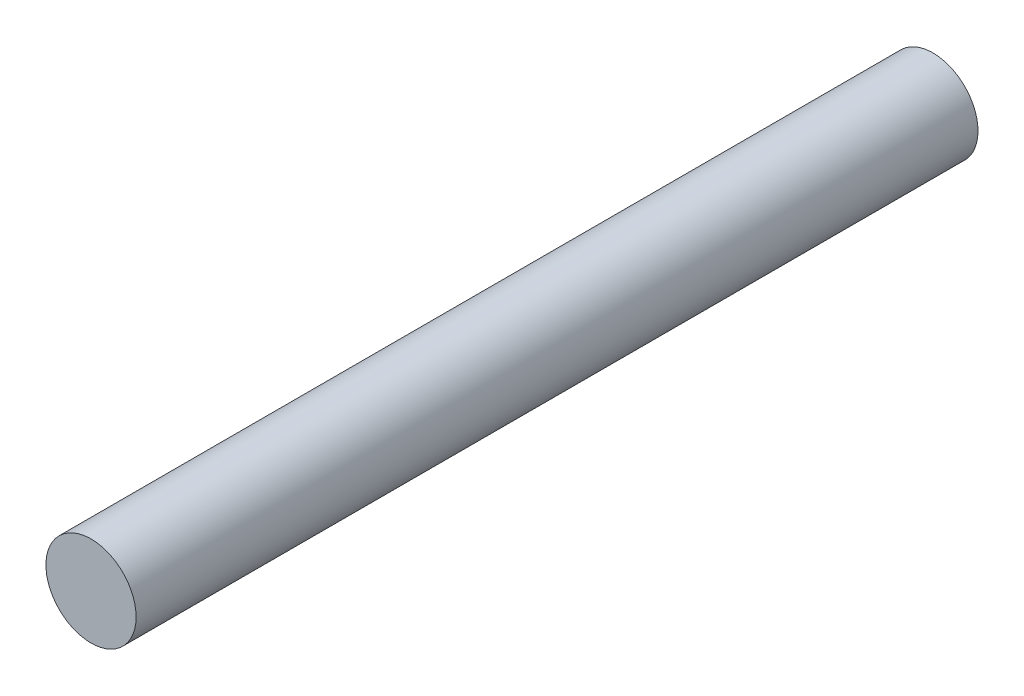
ISO-10303-21;
HEADER;
FILE_DESCRIPTION(('STEP AP214'),'2;1');
FILE_NAME('part.step','',(''),(''),'','','');
FILE_SCHEMA(('AUTOMOTIVE_DESIGN { 1 0 10303 214 1 1 1 1 }'));
ENDSEC;
DATA;
#1=APPLICATION_CONTEXT('core data for automotive mechanical design processes');
#2=APPLICATION_PROTOCOL_DEFINITION('international standard','automotive_design',2000,#1);
#3=PRODUCT_CONTEXT('',#1,'mechanical');
#4=PRODUCT('Part','Part','',(#3));
#5=PRODUCT_RELATED_PRODUCT_CATEGORY('part','',(#4));
#6=PRODUCT_DEFINITION_FORMATION('','',#4);
#7=PRODUCT_DEFINITION_CONTEXT('part definition',#1,'design');
#8=PRODUCT_DEFINITION('design','',#6,#7);
#9=PRODUCT_DEFINITION_SHAPE('','',#8);
#10=(LENGTH_UNIT() NAMED_UNIT(*) SI_UNIT(.MILLI.,.METRE.));
#11=(NAMED_UNIT(*) PLANE_ANGLE_UNIT() SI_UNIT($,.RADIAN.));
#12=(NAMED_UNIT(*) SI_UNIT($,.STERADIAN.) SOLID_ANGLE_UNIT());
#13=UNCERTAINTY_MEASURE_WITH_UNIT(LENGTH_MEASURE(1.E-05),#10,'distance_accuracy_value','');
#14=(GEOMETRIC_REPRESENTATION_CONTEXT(3) GLOBAL_UNCERTAINTY_ASSIGNED_CONTEXT((#13)) GLOBAL_UNIT_ASSIGNED_CONTEXT((#10,
#11,#12)) REPRESENTATION_CONTEXT('',''));
#15=CARTESIAN_POINT('',(0.,0.,0.));
#16=DIRECTION('',(0.,0.,1.));
#17=DIRECTION('',(1.,0.,0.));
#18=AXIS2_PLACEMENT_3D('',#15,#16,#17);
#19=CARTESIAN_POINT('',(0.,0.,177.8));
#20=DIRECTION('',(0.,0.,-1.));
#21=DIRECTION('',(-1.,0.,0.));
#22=AXIS2_PLACEMENT_3D('',#19,#20,#21);
#23=CYLINDRICAL_SURFACE('',#22,9.525);
#24=CARTESIAN_POINT('',(0.,0.,177.8));
#25=DIRECTION('',(0.,0.,1.));
#26=DIRECTION('',(1.,0.,0.));
#27=AXIS2_PLACEMENT_3D('',#24,#25,#26);
#28=CIRCLE('',#27,9.525);
#29=CARTESIAN_POINT('',(9.525,0.,177.8));
#30=VERTEX_POINT('',#29);
#31=EDGE_CURVE('E10',#30,#30,#28,.T.);
#32=ORIENTED_EDGE('',*,*,#31,.F.);
#33=EDGE_LOOP('',(#32));
#34=FACE_BOUND('',#33,.T.);
#35=CARTESIAN_POINT('',(0.,0.,0.));
#36=DIRECTION('',(0.,0.,1.));
#37=DIRECTION('',(1.,0.,0.));
#38=AXIS2_PLACEMENT_3D('',#35,#36,#37);
#39=CIRCLE('',#38,9.525);
#40=CARTESIAN_POINT('',(9.525,0.,0.));
#41=VERTEX_POINT('',#40);
#42=EDGE_CURVE('E34',#41,#41,#39,.T.);
#43=ORIENTED_EDGE('',*,*,#42,.T.);
#44=EDGE_LOOP('',(#43));
#45=FACE_BOUND('',#44,.T.);
#46=ADVANCED_FACE('F31',(#34,#45),#23,.T.);
#47=CARTESIAN_POINT('',(0.,0.,177.8));
#48=DIRECTION('',(0.,0.,1.));
#49=DIRECTION('',(1.,0.,0.));
#50=AXIS2_PLACEMENT_3D('',#47,#48,#49);
#51=PLANE('',#50);
#52=ORIENTED_EDGE('',*,*,#31,.T.);
#53=EDGE_LOOP('',(#52));
#54=FACE_BOUND('',#53,.T.);
#55=ADVANCED_FACE('F46',(#54),#51,.T.);
#56=CARTESIAN_POINT('',(0.,0.,0.));
#57=DIRECTION('',(0.,0.,1.));
#58=DIRECTION('',(1.,0.,0.));
#59=AXIS2_PLACEMENT_3D('',#56,#57,#58);
#60=PLANE('',#59);
#61=ORIENTED_EDGE('',*,*,#42,.F.);
#62=EDGE_LOOP('',(#61));
#63=FACE_BOUND('',#62,.T.);
#64=ADVANCED_FACE('F44',(#63),#60,.F.);
#65=CLOSED_SHELL('',(#46,#55,#64));
#66=MANIFOLD_SOLID_BREP('B2',#65);
#67=ADVANCED_BREP_SHAPE_REPRESENTATION('',(#18,#66),#14);
#68=SHAPE_DEFINITION_REPRESENTATION(#9,#67);
ENDSEC;
END-ISO-10303-21;
